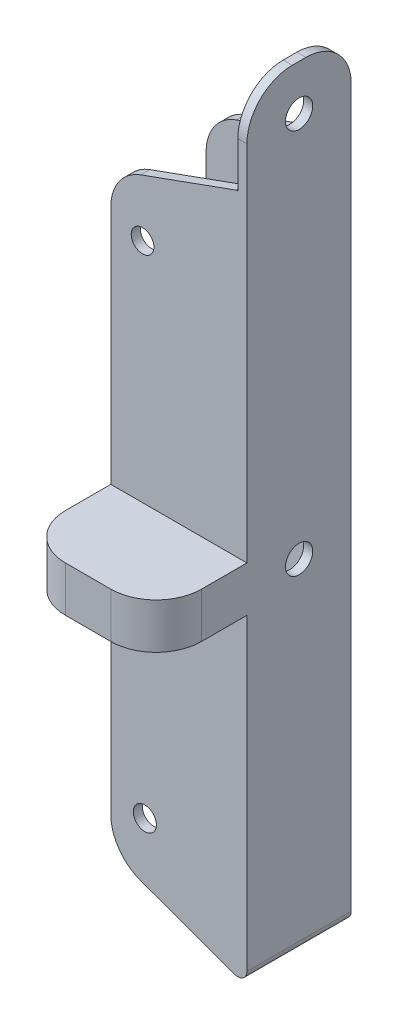
ISO-10303-21;
HEADER;
FILE_DESCRIPTION(('STEP AP214'),'2;1');
FILE_NAME('part.step','',(''),(''),'','','');
FILE_SCHEMA(('AUTOMOTIVE_DESIGN { 1 0 10303 214 1 1 1 1 }'));
ENDSEC;
DATA;
#1=APPLICATION_CONTEXT('core data for automotive mechanical design processes');
#2=APPLICATION_PROTOCOL_DEFINITION('international standard','automotive_design',2000,#1);
#3=PRODUCT_CONTEXT('',#1,'mechanical');
#4=PRODUCT('Part','Part','',(#3));
#5=PRODUCT_RELATED_PRODUCT_CATEGORY('part','',(#4));
#6=PRODUCT_DEFINITION_FORMATION('','',#4);
#7=PRODUCT_DEFINITION_CONTEXT('part definition',#1,'design');
#8=PRODUCT_DEFINITION('design','',#6,#7);
#9=PRODUCT_DEFINITION_SHAPE('','',#8);
#10=(LENGTH_UNIT() NAMED_UNIT(*) SI_UNIT(.MILLI.,.METRE.));
#11=(NAMED_UNIT(*) PLANE_ANGLE_UNIT() SI_UNIT($,.RADIAN.));
#12=(NAMED_UNIT(*) SI_UNIT($,.STERADIAN.) SOLID_ANGLE_UNIT());
#13=UNCERTAINTY_MEASURE_WITH_UNIT(LENGTH_MEASURE(1.E-05),#10,'distance_accuracy_value','');
#14=(GEOMETRIC_REPRESENTATION_CONTEXT(3) GLOBAL_UNCERTAINTY_ASSIGNED_CONTEXT((#13)) GLOBAL_UNIT_ASSIGNED_CONTEXT((#10,
#11,#12)) REPRESENTATION_CONTEXT('',''));
#15=CARTESIAN_POINT('',(0.,0.,0.));
#16=DIRECTION('',(0.,0.,1.));
#17=DIRECTION('',(1.,0.,0.));
#18=AXIS2_PLACEMENT_3D('',#15,#16,#17);
#19=CARTESIAN_POINT('',(0.,0.,23.));
#20=DIRECTION('',(0.,1.,0.));
#21=DIRECTION('',(0.,0.,1.));
#22=AXIS2_PLACEMENT_3D('',#19,#20,#21);
#23=PLANE('',#22);
#24=DIRECTION('',(1.,0.,0.));
#25=VECTOR('',#24,1.);
#26=CARTESIAN_POINT('',(0.,0.,0.));
#27=LINE('',#26,#25);
#28=CARTESIAN_POINT('',(27.6983675078145,0.,0.));
#29=VERTEX_POINT('',#28);
#30=CARTESIAN_POINT('',(28.,0.,0.));
#31=VERTEX_POINT('',#30);
#32=EDGE_CURVE('E257',#29,#31,#27,.T.);
#33=ORIENTED_EDGE('',*,*,#32,.T.);
#34=DIRECTION('',(0.,0.,-1.));
#35=VECTOR('',#34,1.);
#36=CARTESIAN_POINT('',(28.,0.,23.));
#37=LINE('',#36,#35);
#38=CARTESIAN_POINT('',(28.,0.,2.));
#39=VERTEX_POINT('',#38);
#40=EDGE_CURVE('E43',#31,#39,#37,.F.);
#41=ORIENTED_EDGE('',*,*,#40,.T.);
#42=DIRECTION('',(1.,0.,0.));
#43=VECTOR('',#42,1.);
#44=CARTESIAN_POINT('',(0.,0.,2.));
#45=LINE('',#44,#43);
#46=CARTESIAN_POINT('',(27.6983675078145,0.,2.));
#47=VERTEX_POINT('',#46);
#48=EDGE_CURVE('E258',#47,#39,#45,.T.);
#49=ORIENTED_EDGE('',*,*,#48,.F.);
#50=DIRECTION('',(0.,0.,1.));
#51=VECTOR('',#50,1.);
#52=CARTESIAN_POINT('',(27.6983675078145,0.,-7.));
#53=LINE('',#52,#51);
#54=EDGE_CURVE('E226',#29,#47,#53,.T.);
#55=ORIENTED_EDGE('',*,*,#54,.F.);
#56=EDGE_LOOP('',(#33,#41,#49,#55));
#57=FACE_BOUND('',#56,.T.);
#58=ADVANCED_FACE('F35',(#57),#23,.F.);
#59=CARTESIAN_POINT('',(0.,0.,23.));
#60=DIRECTION('',(0.,0.,-1.));
#61=DIRECTION('',(-1.,0.,0.));
#62=AXIS2_PLACEMENT_3D('',#59,#60,#61);
#63=PLANE('',#62);
#64=CARTESIAN_POINT('',(7.5,20.,23.));
#65=DIRECTION('',(0.,0.,1.));
#66=DIRECTION('',(1.,0.,0.));
#67=AXIS2_PLACEMENT_3D('',#64,#65,#66);
#68=CIRCLE('',#67,2.54323018402444);
#69=CARTESIAN_POINT('',(10.0432301840244,20.,23.));
#70=VERTEX_POINT('',#69);
#71=EDGE_CURVE('E318',#70,#70,#68,.T.);
#72=ORIENTED_EDGE('',*,*,#71,.F.);
#73=EDGE_LOOP('',(#72));
#74=FACE_BOUND('',#73,.T.);
#75=DIRECTION('',(1.,0.,0.));
#76=VECTOR('',#75,1.);
#77=CARTESIAN_POINT('',(0.,0.,23.));
#78=LINE('',#77,#76);
#79=CARTESIAN_POINT('',(27.6983675078145,0.,23.));
#80=VERTEX_POINT('',#79);
#81=CARTESIAN_POINT('',(28.,0.,23.));
#82=VERTEX_POINT('',#81);
#83=EDGE_CURVE('E395',#80,#82,#78,.T.);
#84=ORIENTED_EDGE('',*,*,#83,.T.);
#85=CARTESIAN_POINT('',(28.,2.,23.));
#86=DIRECTION('',(0.,0.,-1.));
#87=DIRECTION('',(-1.,0.,0.));
#88=AXIS2_PLACEMENT_3D('',#85,#86,#87);
#89=CIRCLE('',#88,2.);
#90=CARTESIAN_POINT('',(30.,2.,23.));
#91=VERTEX_POINT('',#90);
#92=EDGE_CURVE('E11',#82,#91,#89,.F.);
#93=ORIENTED_EDGE('',*,*,#92,.T.);
#94=DIRECTION('',(0.,1.,0.));
#95=VECTOR('',#94,1.);
#96=CARTESIAN_POINT('',(30.,0.,23.));
#97=LINE('',#96,#95);
#98=CARTESIAN_POINT('',(30.,70.,23.));
#99=VERTEX_POINT('',#98);
#100=EDGE_CURVE('E245',#91,#99,#97,.T.);
#101=ORIENTED_EDGE('',*,*,#100,.T.);
#102=DIRECTION('',(1.,0.,0.));
#103=VECTOR('',#102,1.);
#104=CARTESIAN_POINT('',(0.,70.,23.));
#105=LINE('',#104,#103);
#106=CARTESIAN_POINT('',(0.,70.,23.));
#107=VERTEX_POINT('',#106);
#108=EDGE_CURVE('E275',#107,#99,#105,.T.);
#109=ORIENTED_EDGE('',*,*,#108,.F.);
#110=DIRECTION('',(0.,-1.,0.));
#111=VECTOR('',#110,1.);
#112=CARTESIAN_POINT('',(0.,0.,23.));
#113=LINE('',#112,#111);
#114=CARTESIAN_POINT('',(0.,17.0214435124316,23.));
#115=VERTEX_POINT('',#114);
#116=EDGE_CURVE('E264',#107,#115,#113,.T.);
#117=ORIENTED_EDGE('',*,*,#116,.T.);
#118=CARTESIAN_POINT('',(10.,17.0214435124316,23.));
#119=DIRECTION('',(0.,0.,-1.));
#120=DIRECTION('',(-1.,0.,0.));
#121=AXIS2_PLACEMENT_3D('',#118,#119,#120);
#122=CIRCLE('',#121,10.);
#123=CARTESIAN_POINT('',(6.60421273783303,7.61566715584599,23.));
#124=VERTEX_POINT('',#123);
#125=EDGE_CURVE('E299',#115,#124,#122,.F.);
#126=ORIENTED_EDGE('',*,*,#125,.T.);
#127=DIRECTION('',(-0.940577635658559,0.339578726216697,0.));
#128=VECTOR('',#127,1.);
#129=CARTESIAN_POINT('',(3.19400155424846,8.84686288701045,23.));
#130=LINE('',#129,#128);
#131=EDGE_CURVE('E533',#80,#124,#130,.T.);
#132=ORIENTED_EDGE('',*,*,#131,.F.);
#133=EDGE_LOOP('',(#84,#93,#101,#109,#117,#126,#132));
#134=FACE_BOUND('',#133,.T.);
#135=ADVANCED_FACE('F488',(#74,#134),#63,.F.);
#136=CARTESIAN_POINT('',(0.,150.,23.));
#137=DIRECTION('',(0.,-1.,0.));
#138=DIRECTION('',(0.,0.,-1.));
#139=AXIS2_PLACEMENT_3D('',#136,#137,#138);
#140=PLANE('',#139);
#141=DIRECTION('',(-1.,0.,0.));
#142=VECTOR('',#141,1.);
#143=CARTESIAN_POINT('',(0.,150.,0.));
#144=LINE('',#143,#142);
#145=CARTESIAN_POINT('',(28.0053234200893,150.,0.));
#146=VERTEX_POINT('',#145);
#147=CARTESIAN_POINT('',(27.6983675078144,150.,0.));
#148=VERTEX_POINT('',#147);
#149=EDGE_CURVE('E262',#146,#148,#144,.T.);
#150=ORIENTED_EDGE('',*,*,#149,.T.);
#151=DIRECTION('',(0.,0.,1.));
#152=VECTOR('',#151,1.);
#153=CARTESIAN_POINT('',(27.6983675078144,150.,-7.));
#154=LINE('',#153,#152);
#155=CARTESIAN_POINT('',(27.6983675078144,150.,2.));
#156=VERTEX_POINT('',#155);
#157=EDGE_CURVE('E237',#148,#156,#154,.T.);
#158=ORIENTED_EDGE('',*,*,#157,.T.);
#159=DIRECTION('',(1.,0.,0.));
#160=VECTOR('',#159,1.);
#161=CARTESIAN_POINT('',(0.,150.,2.));
#162=LINE('',#161,#160);
#163=CARTESIAN_POINT('',(28.,150.,2.));
#164=VERTEX_POINT('',#163);
#165=EDGE_CURVE('E432',#156,#164,#162,.T.);
#166=ORIENTED_EDGE('',*,*,#165,.T.);
#167=DIRECTION('',(0.,0.,1.));
#168=VECTOR('',#167,1.);
#169=CARTESIAN_POINT('',(28.,150.,0.));
#170=LINE('',#169,#168);
#171=CARTESIAN_POINT('',(28.,150.,21.));
#172=VERTEX_POINT('',#171);
#173=EDGE_CURVE('E383',#164,#172,#170,.T.);
#174=ORIENTED_EDGE('',*,*,#173,.T.);
#175=DIRECTION('',(1.,0.,0.));
#176=VECTOR('',#175,1.);
#177=CARTESIAN_POINT('',(0.,150.,21.));
#178=LINE('',#177,#176);
#179=CARTESIAN_POINT('',(27.6983675078145,150.,21.));
#180=VERTEX_POINT('',#179);
#181=EDGE_CURVE('E236',#180,#172,#178,.T.);
#182=ORIENTED_EDGE('',*,*,#181,.F.);
#183=CARTESIAN_POINT('',(27.6983675078144,150.,23.));
#184=VERTEX_POINT('',#183);
#185=EDGE_CURVE('E220',#180,#184,#154,.T.);
#186=ORIENTED_EDGE('',*,*,#185,.T.);
#187=DIRECTION('',(-1.,0.,0.));
#188=VECTOR('',#187,1.);
#189=CARTESIAN_POINT('',(0.,150.,23.));
#190=LINE('',#189,#188);
#191=CARTESIAN_POINT('',(28.0053234200893,150.,23.));
#192=VERTEX_POINT('',#191);
#193=EDGE_CURVE('E233',#192,#184,#190,.T.);
#194=ORIENTED_EDGE('',*,*,#193,.F.);
#195=DIRECTION('',(0.,0.,1.));
#196=VECTOR('',#195,1.);
#197=CARTESIAN_POINT('',(28.0053234200893,150.,0.));
#198=LINE('',#197,#196);
#199=EDGE_CURVE('E272',#146,#192,#198,.T.);
#200=ORIENTED_EDGE('',*,*,#199,.F.);
#201=EDGE_LOOP('',(#150,#158,#166,#174,#182,#186,#194,#200));
#202=FACE_BOUND('',#201,.T.);
#203=ADVANCED_FACE('F231',(#202),#140,.F.);
#204=CARTESIAN_POINT('',(0.,0.,23.));
#205=DIRECTION('',(1.,0.,0.));
#206=DIRECTION('',(0.,0.,-1.));
#207=AXIS2_PLACEMENT_3D('',#204,#205,#206);
#208=PLANE('',#207);
#209=DIRECTION('',(0.,-1.,0.));
#210=VECTOR('',#209,1.);
#211=CARTESIAN_POINT('',(0.,0.,0.));
#212=LINE('',#211,#210);
#213=CARTESIAN_POINT('',(0.,132.978556487568,0.));
#214=VERTEX_POINT('',#213);
#215=CARTESIAN_POINT('',(0.,17.0214435124316,0.));
#216=VERTEX_POINT('',#215);
#217=EDGE_CURVE('E254',#214,#216,#212,.T.);
#218=ORIENTED_EDGE('',*,*,#217,.T.);
#219=DIRECTION('',(0.,0.,1.));
#220=VECTOR('',#219,1.);
#221=CARTESIAN_POINT('',(0.,17.0214435124316,23.));
#222=LINE('',#221,#220);
#223=CARTESIAN_POINT('',(0.,17.0214435124316,2.));
#224=VERTEX_POINT('',#223);
#225=EDGE_CURVE('E281',#216,#224,#222,.T.);
#226=ORIENTED_EDGE('',*,*,#225,.T.);
#227=DIRECTION('',(0.,1.,0.));
#228=VECTOR('',#227,1.);
#229=CARTESIAN_POINT('',(0.,-43.,2.));
#230=LINE('',#229,#228);
#231=CARTESIAN_POINT('',(0.,132.978556487568,2.));
#232=VERTEX_POINT('',#231);
#233=EDGE_CURVE('E384',#224,#232,#230,.T.);
#234=ORIENTED_EDGE('',*,*,#233,.T.);
#235=DIRECTION('',(0.,0.,1.));
#236=VECTOR('',#235,1.);
#237=CARTESIAN_POINT('',(0.,132.978556487568,23.));
#238=LINE('',#237,#236);
#239=EDGE_CURVE('E279',#232,#214,#238,.F.);
#240=ORIENTED_EDGE('',*,*,#239,.T.);
#241=EDGE_LOOP('',(#218,#226,#234,#240));
#242=FACE_BOUND('',#241,.T.);
#243=ADVANCED_FACE('F497',(#242),#208,.F.);
#244=DIRECTION('',(1.,0.,0.));
#245=VECTOR('',#244,1.);
#246=CARTESIAN_POINT('',(0.,0.,21.));
#247=LINE('',#246,#245);
#248=CARTESIAN_POINT('',(27.6983675078145,0.,21.));
#249=VERTEX_POINT('',#248);
#250=CARTESIAN_POINT('',(28.,0.,21.));
#251=VERTEX_POINT('',#250);
#252=EDGE_CURVE('E388',#249,#251,#247,.T.);
#253=ORIENTED_EDGE('',*,*,#252,.T.);
#254=DIRECTION('',(0.,0.,-1.));
#255=VECTOR('',#254,1.);
#256=CARTESIAN_POINT('',(28.,0.,23.));
#257=LINE('',#256,#255);
#258=EDGE_CURVE('E50',#251,#82,#257,.F.);
#259=ORIENTED_EDGE('',*,*,#258,.T.);
#260=ORIENTED_EDGE('',*,*,#83,.F.);
#261=EDGE_CURVE('E537',#249,#80,#53,.T.);
#262=ORIENTED_EDGE('',*,*,#261,.F.);
#263=EDGE_LOOP('',(#253,#259,#260,#262));
#264=FACE_BOUND('',#263,.T.);
#265=ADVANCED_FACE('F500',(#264),#23,.F.);
#266=DIRECTION('',(0.,0.,-1.));
#267=VECTOR('',#266,1.);
#268=CARTESIAN_POINT('',(0.,70.,43.));
#269=LINE('',#268,#267);
#270=CARTESIAN_POINT('',(0.,70.,33.));
#271=VERTEX_POINT('',#270);
#272=EDGE_CURVE('E469',#271,#107,#269,.T.);
#273=ORIENTED_EDGE('',*,*,#272,.F.);
#274=DIRECTION('',(0.,-1.,0.));
#275=VECTOR('',#274,1.);
#276=CARTESIAN_POINT('',(0.,80.,33.));
#277=LINE('',#276,#275);
#278=CARTESIAN_POINT('',(0.,80.,33.));
#279=VERTEX_POINT('',#278);
#280=EDGE_CURVE('E334',#271,#279,#277,.F.);
#281=ORIENTED_EDGE('',*,*,#280,.T.);
#282=DIRECTION('',(0.,0.,-1.));
#283=VECTOR('',#282,1.);
#284=CARTESIAN_POINT('',(0.,80.,43.));
#285=LINE('',#284,#283);
#286=CARTESIAN_POINT('',(0.,80.,23.));
#287=VERTEX_POINT('',#286);
#288=EDGE_CURVE('E452',#279,#287,#285,.T.);
#289=ORIENTED_EDGE('',*,*,#288,.T.);
#290=CARTESIAN_POINT('',(0.,132.978556487568,23.));
#291=VERTEX_POINT('',#290);
#292=EDGE_CURVE('E393',#291,#287,#113,.T.);
#293=ORIENTED_EDGE('',*,*,#292,.F.);
#294=DIRECTION('',(0.,0.,1.));
#295=VECTOR('',#294,1.);
#296=CARTESIAN_POINT('',(0.,132.978556487568,23.));
#297=LINE('',#296,#295);
#298=CARTESIAN_POINT('',(0.,132.978556487568,21.));
#299=VERTEX_POINT('',#298);
#300=EDGE_CURVE('E294',#291,#299,#297,.F.);
#301=ORIENTED_EDGE('',*,*,#300,.T.);
#302=DIRECTION('',(0.,1.,0.));
#303=VECTOR('',#302,1.);
#304=CARTESIAN_POINT('',(0.,-43.,21.));
#305=LINE('',#304,#303);
#306=CARTESIAN_POINT('',(0.,17.0214435124316,21.));
#307=VERTEX_POINT('',#306);
#308=EDGE_CURVE('E434',#307,#299,#305,.T.);
#309=ORIENTED_EDGE('',*,*,#308,.F.);
#310=DIRECTION('',(0.,0.,1.));
#311=VECTOR('',#310,1.);
#312=CARTESIAN_POINT('',(0.,17.0214435124316,23.));
#313=LINE('',#312,#311);
#314=EDGE_CURVE('E296',#307,#115,#313,.T.);
#315=ORIENTED_EDGE('',*,*,#314,.T.);
#316=ORIENTED_EDGE('',*,*,#116,.F.);
#317=EDGE_LOOP('',(#273,#281,#289,#293,#301,#309,#315,#316));
#318=FACE_BOUND('',#317,.T.);
#319=ADVANCED_FACE('F450',(#318),#208,.F.);
#320=CARTESIAN_POINT('',(30.,0.,23.));
#321=DIRECTION('',(-1.,0.,0.));
#322=DIRECTION('',(0.,0.,1.));
#323=AXIS2_PLACEMENT_3D('',#320,#321,#322);
#324=PLANE('',#323);
#325=CARTESIAN_POINT('',(30.,75.,11.5));
#326=DIRECTION('',(1.,0.,0.));
#327=DIRECTION('',(0.,0.,-1.));
#328=AXIS2_PLACEMENT_3D('',#325,#326,#327);
#329=CIRCLE('',#328,3.);
#330=CARTESIAN_POINT('',(30.,75.,8.5));
#331=VERTEX_POINT('',#330);
#332=EDGE_CURVE('E269',#331,#331,#329,.T.);
#333=ORIENTED_EDGE('',*,*,#332,.F.);
#334=EDGE_LOOP('',(#333));
#335=FACE_BOUND('',#334,.T.);
#336=CARTESIAN_POINT('',(30.,160.,11.5));
#337=DIRECTION('',(1.,0.,0.));
#338=DIRECTION('',(0.,0.,-1.));
#339=AXIS2_PLACEMENT_3D('',#336,#337,#338);
#340=CIRCLE('',#339,3.);
#341=CARTESIAN_POINT('',(30.,160.,8.5));
#342=VERTEX_POINT('',#341);
#343=EDGE_CURVE('E424',#342,#342,#340,.T.);
#344=ORIENTED_EDGE('',*,*,#343,.F.);
#345=EDGE_LOOP('',(#344));
#346=FACE_BOUND('',#345,.T.);
#347=ORIENTED_EDGE('',*,*,#100,.F.);
#348=DIRECTION('',(0.,0.,-1.));
#349=VECTOR('',#348,1.);
#350=CARTESIAN_POINT('',(30.,2.,23.));
#351=LINE('',#350,#349);
#352=CARTESIAN_POINT('',(30.,2.,0.));
#353=VERTEX_POINT('',#352);
#354=EDGE_CURVE('E354',#91,#353,#351,.T.);
#355=ORIENTED_EDGE('',*,*,#354,.T.);
#356=DIRECTION('',(0.,1.,0.));
#357=VECTOR('',#356,1.);
#358=CARTESIAN_POINT('',(30.,0.,0.));
#359=LINE('',#358,#357);
#360=CARTESIAN_POINT('',(30.,160.,0.));
#361=VERTEX_POINT('',#360);
#362=EDGE_CURVE('E260',#353,#361,#359,.T.);
#363=ORIENTED_EDGE('',*,*,#362,.T.);
#364=CARTESIAN_POINT('',(30.,160.,10.));
#365=DIRECTION('',(-1.,0.,0.));
#366=DIRECTION('',(0.,0.,1.));
#367=AXIS2_PLACEMENT_3D('',#364,#365,#366);
#368=CIRCLE('',#367,10.);
#369=CARTESIAN_POINT('',(30.,170.,10.));
#370=VERTEX_POINT('',#369);
#371=EDGE_CURVE('E350',#361,#370,#368,.F.);
#372=ORIENTED_EDGE('',*,*,#371,.T.);
#373=DIRECTION('',(0.,0.,1.));
#374=VECTOR('',#373,1.);
#375=CARTESIAN_POINT('',(30.,170.,0.));
#376=LINE('',#375,#374);
#377=CARTESIAN_POINT('',(30.,170.,13.));
#378=VERTEX_POINT('',#377);
#379=EDGE_CURVE('E419',#370,#378,#376,.T.);
#380=ORIENTED_EDGE('',*,*,#379,.T.);
#381=CARTESIAN_POINT('',(30.,160.,13.));
#382=DIRECTION('',(-1.,0.,0.));
#383=DIRECTION('',(0.,0.,1.));
#384=AXIS2_PLACEMENT_3D('',#381,#382,#383);
#385=CIRCLE('',#384,10.);
#386=CARTESIAN_POINT('',(30.,160.,23.));
#387=VERTEX_POINT('',#386);
#388=EDGE_CURVE('E348',#378,#387,#385,.F.);
#389=ORIENTED_EDGE('',*,*,#388,.T.);
#390=CARTESIAN_POINT('',(30.,80.,23.));
#391=VERTEX_POINT('',#390);
#392=EDGE_CURVE('E250',#391,#387,#97,.T.);
#393=ORIENTED_EDGE('',*,*,#392,.F.);
#394=DIRECTION('',(0.,0.,-1.));
#395=VECTOR('',#394,1.);
#396=CARTESIAN_POINT('',(30.,80.,43.));
#397=LINE('',#396,#395);
#398=CARTESIAN_POINT('',(30.,80.,33.));
#399=VERTEX_POINT('',#398);
#400=EDGE_CURVE('E456',#399,#391,#397,.T.);
#401=ORIENTED_EDGE('',*,*,#400,.F.);
#402=DIRECTION('',(0.,1.,0.));
#403=VECTOR('',#402,1.);
#404=CARTESIAN_POINT('',(30.,70.,33.));
#405=LINE('',#404,#403);
#406=CARTESIAN_POINT('',(30.,70.,33.));
#407=VERTEX_POINT('',#406);
#408=EDGE_CURVE('E328',#399,#407,#405,.F.);
#409=ORIENTED_EDGE('',*,*,#408,.T.);
#410=DIRECTION('',(0.,0.,-1.));
#411=VECTOR('',#410,1.);
#412=CARTESIAN_POINT('',(30.,70.,43.));
#413=LINE('',#412,#411);
#414=EDGE_CURVE('E459',#407,#99,#413,.T.);
#415=ORIENTED_EDGE('',*,*,#414,.T.);
#416=EDGE_LOOP('',(#347,#355,#363,#372,#380,#389,#393,#401,#409,#415));
#417=FACE_BOUND('',#416,.T.);
#418=ADVANCED_FACE('F479',(#335,#346,#417),#324,.F.);
#419=CARTESIAN_POINT('',(7.00133085502233,130.,23.));
#420=DIRECTION('',(0.,0.,1.));
#421=DIRECTION('',(1.,0.,0.));
#422=AXIS2_PLACEMENT_3D('',#419,#420,#421);
#423=CIRCLE('',#422,2.5);
#424=CARTESIAN_POINT('',(9.50133085502233,130.,23.));
#425=VERTEX_POINT('',#424);
#426=EDGE_CURVE('E276',#425,#425,#423,.T.);
#427=ORIENTED_EDGE('',*,*,#426,.F.);
#428=EDGE_LOOP('',(#427));
#429=FACE_BOUND('',#428,.T.);
#430=ORIENTED_EDGE('',*,*,#392,.T.);
#431=DIRECTION('',(-1.,0.,0.));
#432=VECTOR('',#431,1.);
#433=CARTESIAN_POINT('',(28.0053234200893,160.,23.));
#434=LINE('',#433,#432);
#435=CARTESIAN_POINT('',(28.0053234200893,160.,23.));
#436=VERTEX_POINT('',#435);
#437=EDGE_CURVE('E352',#387,#436,#434,.T.);
#438=ORIENTED_EDGE('',*,*,#437,.T.);
#439=DIRECTION('',(0.,-1.,0.));
#440=VECTOR('',#439,1.);
#441=CARTESIAN_POINT('',(28.0053234200893,170.,23.));
#442=LINE('',#441,#440);
#443=EDGE_CURVE('E243',#436,#192,#442,.T.);
#444=ORIENTED_EDGE('',*,*,#443,.T.);
#445=ORIENTED_EDGE('',*,*,#193,.T.);
#446=DIRECTION('',(0.940577635658559,0.339578726216698,0.));
#447=VECTOR('',#446,1.);
#448=CARTESIAN_POINT('',(-44.7160217594785,123.856080418146,23.));
#449=LINE('',#448,#447);
#450=CARTESIAN_POINT('',(6.60421273783302,142.384332844154,23.));
#451=VERTEX_POINT('',#450);
#452=EDGE_CURVE('E216',#451,#184,#449,.T.);
#453=ORIENTED_EDGE('',*,*,#452,.F.);
#454=CARTESIAN_POINT('',(10.,132.978556487568,23.));
#455=DIRECTION('',(0.,0.,-1.));
#456=DIRECTION('',(-1.,0.,0.));
#457=AXIS2_PLACEMENT_3D('',#454,#455,#456);
#458=CIRCLE('',#457,10.);
#459=EDGE_CURVE('E311',#451,#291,#458,.F.);
#460=ORIENTED_EDGE('',*,*,#459,.T.);
#461=ORIENTED_EDGE('',*,*,#292,.T.);
#462=DIRECTION('',(1.,0.,0.));
#463=VECTOR('',#462,1.);
#464=CARTESIAN_POINT('',(0.,80.,23.));
#465=LINE('',#464,#463);
#466=EDGE_CURVE('E402',#287,#391,#465,.T.);
#467=ORIENTED_EDGE('',*,*,#466,.T.);
#468=EDGE_LOOP('',(#430,#438,#444,#445,#453,#460,#461,#467));
#469=FACE_BOUND('',#468,.T.);
#470=ADVANCED_FACE('F240',(#429,#469),#63,.F.);
#471=CARTESIAN_POINT('',(0.,0.,0.));
#472=DIRECTION('',(0.,0.,-1.));
#473=DIRECTION('',(-1.,0.,0.));
#474=AXIS2_PLACEMENT_3D('',#471,#472,#473);
#475=PLANE('',#474);
#476=CARTESIAN_POINT('',(7.5,20.,0.));
#477=DIRECTION('',(0.,0.,-1.));
#478=DIRECTION('',(-1.,0.,0.));
#479=AXIS2_PLACEMENT_3D('',#476,#477,#478);
#480=CIRCLE('',#479,2.54323018402444);
#481=CARTESIAN_POINT('',(4.95676981597556,20.,0.));
#482=VERTEX_POINT('',#481);
#483=EDGE_CURVE('E538',#482,#482,#480,.T.);
#484=ORIENTED_EDGE('',*,*,#483,.F.);
#485=EDGE_LOOP('',(#484));
#486=FACE_BOUND('',#485,.T.);
#487=ORIENTED_EDGE('',*,*,#362,.F.);
#488=CARTESIAN_POINT('',(28.,2.,0.));
#489=DIRECTION('',(0.,0.,-1.));
#490=DIRECTION('',(-1.,0.,0.));
#491=AXIS2_PLACEMENT_3D('',#488,#489,#490);
#492=CIRCLE('',#491,2.);
#493=EDGE_CURVE('E58',#353,#31,#492,.T.);
#494=ORIENTED_EDGE('',*,*,#493,.T.);
#495=ORIENTED_EDGE('',*,*,#32,.F.);
#496=DIRECTION('',(0.940577635658559,-0.339578726216697,0.));
#497=VECTOR('',#496,1.);
#498=CARTESIAN_POINT('',(3.19400155424846,8.84686288701046,0.));
#499=LINE('',#498,#497);
#500=CARTESIAN_POINT('',(6.60421273783303,7.61566715584599,0.));
#501=VERTEX_POINT('',#500);
#502=EDGE_CURVE('E545',#501,#29,#499,.T.);
#503=ORIENTED_EDGE('',*,*,#502,.F.);
#504=CARTESIAN_POINT('',(10.,17.0214435124316,0.));
#505=DIRECTION('',(0.,0.,-1.));
#506=DIRECTION('',(-1.,0.,0.));
#507=AXIS2_PLACEMENT_3D('',#504,#505,#506);
#508=CIRCLE('',#507,10.);
#509=EDGE_CURVE('E292',#501,#216,#508,.T.);
#510=ORIENTED_EDGE('',*,*,#509,.T.);
#511=ORIENTED_EDGE('',*,*,#217,.F.);
#512=CARTESIAN_POINT('',(10.,132.978556487568,0.));
#513=DIRECTION('',(0.,0.,-1.));
#514=DIRECTION('',(-1.,0.,0.));
#515=AXIS2_PLACEMENT_3D('',#512,#513,#514);
#516=CIRCLE('',#515,10.);
#517=CARTESIAN_POINT('',(6.60421273783303,142.384332844154,0.));
#518=VERTEX_POINT('',#517);
#519=EDGE_CURVE('E290',#214,#518,#516,.T.);
#520=ORIENTED_EDGE('',*,*,#519,.T.);
#521=DIRECTION('',(-0.940577635658559,-0.339578726216698,0.));
#522=VECTOR('',#521,1.);
#523=CARTESIAN_POINT('',(-44.7160217594785,123.856080418146,0.));
#524=LINE('',#523,#522);
#525=EDGE_CURVE('E516',#148,#518,#524,.T.);
#526=ORIENTED_EDGE('',*,*,#525,.F.);
#527=ORIENTED_EDGE('',*,*,#149,.F.);
#528=DIRECTION('',(0.,-1.,0.));
#529=VECTOR('',#528,1.);
#530=CARTESIAN_POINT('',(28.0053234200893,170.,0.));
#531=LINE('',#530,#529);
#532=CARTESIAN_POINT('',(28.0053234200893,160.,0.));
#533=VERTEX_POINT('',#532);
#534=EDGE_CURVE('E427',#533,#146,#531,.T.);
#535=ORIENTED_EDGE('',*,*,#534,.F.);
#536=DIRECTION('',(-1.,0.,0.));
#537=VECTOR('',#536,1.);
#538=CARTESIAN_POINT('',(0.,160.,0.));
#539=LINE('',#538,#537);
#540=EDGE_CURVE('E345',#533,#361,#539,.F.);
#541=ORIENTED_EDGE('',*,*,#540,.T.);
#542=EDGE_LOOP('',(#487,#494,#495,#503,#510,#511,#520,#526,#527,#535,#541));
#543=FACE_BOUND('',#542,.T.);
#544=ADVANCED_FACE('F505',(#486,#543),#475,.T.);
#545=CARTESIAN_POINT('',(0.,-43.,2.));
#546=DIRECTION('',(0.,0.,1.));
#547=DIRECTION('',(1.,0.,0.));
#548=AXIS2_PLACEMENT_3D('',#545,#546,#547);
#549=PLANE('',#548);
#550=CARTESIAN_POINT('',(7.5,20.,2.));
#551=DIRECTION('',(0.,0.,1.));
#552=DIRECTION('',(1.,0.,0.));
#553=AXIS2_PLACEMENT_3D('',#550,#551,#552);
#554=CIRCLE('',#553,2.54323018402444);
#555=CARTESIAN_POINT('',(10.0432301840244,20.,2.));
#556=VERTEX_POINT('',#555);
#557=EDGE_CURVE('E317',#556,#556,#554,.T.);
#558=ORIENTED_EDGE('',*,*,#557,.F.);
#559=EDGE_LOOP('',(#558));
#560=FACE_BOUND('',#559,.T.);
#561=ORIENTED_EDGE('',*,*,#233,.F.);
#562=CARTESIAN_POINT('',(10.,17.0214435124316,2.));
#563=DIRECTION('',(0.,0.,1.));
#564=DIRECTION('',(1.,0.,0.));
#565=AXIS2_PLACEMENT_3D('',#562,#563,#564);
#566=CIRCLE('',#565,10.);
#567=CARTESIAN_POINT('',(6.60421273783303,7.615667155846,2.));
#568=VERTEX_POINT('',#567);
#569=EDGE_CURVE('E286',#224,#568,#566,.T.);
#570=ORIENTED_EDGE('',*,*,#569,.T.);
#571=DIRECTION('',(-0.940577635658559,0.339578726216697,0.));
#572=VECTOR('',#571,1.);
#573=CARTESIAN_POINT('',(16.9282082375169,3.88837330115541,2.));
#574=LINE('',#573,#572);
#575=EDGE_CURVE('E375',#47,#568,#574,.T.);
#576=ORIENTED_EDGE('',*,*,#575,.F.);
#577=ORIENTED_EDGE('',*,*,#48,.T.);
#578=DIRECTION('',(0.,1.,0.));
#579=VECTOR('',#578,1.);
#580=CARTESIAN_POINT('',(28.,-43.,2.));
#581=LINE('',#580,#579);
#582=EDGE_CURVE('E372',#39,#164,#581,.T.);
#583=ORIENTED_EDGE('',*,*,#582,.T.);
#584=ORIENTED_EDGE('',*,*,#165,.F.);
#585=DIRECTION('',(0.940577635658559,0.339578726216698,0.));
#586=VECTOR('',#585,1.);
#587=CARTESIAN_POINT('',(-58.4502284427469,118.897590832291,2.));
#588=LINE('',#587,#586);
#589=CARTESIAN_POINT('',(6.60421273783302,142.384332844154,2.));
#590=VERTEX_POINT('',#589);
#591=EDGE_CURVE('E519',#590,#156,#588,.T.);
#592=ORIENTED_EDGE('',*,*,#591,.F.);
#593=CARTESIAN_POINT('',(10.,132.978556487568,2.));
#594=DIRECTION('',(0.,0.,1.));
#595=DIRECTION('',(1.,0.,0.));
#596=AXIS2_PLACEMENT_3D('',#593,#594,#595);
#597=CIRCLE('',#596,10.);
#598=EDGE_CURVE('E284',#590,#232,#597,.T.);
#599=ORIENTED_EDGE('',*,*,#598,.T.);
#600=EDGE_LOOP('',(#561,#570,#576,#577,#583,#584,#592,#599));
#601=FACE_BOUND('',#600,.T.);
#602=ADVANCED_FACE('F370',(#560,#601),#549,.T.);
#603=CARTESIAN_POINT('',(28.,-43.,0.));
#604=DIRECTION('',(-1.,0.,0.));
#605=DIRECTION('',(0.,0.,1.));
#606=AXIS2_PLACEMENT_3D('',#603,#604,#605);
#607=PLANE('',#606);
#608=CARTESIAN_POINT('',(28.,75.,11.5));
#609=DIRECTION('',(-1.,0.,0.));
#610=DIRECTION('',(0.,0.,1.));
#611=AXIS2_PLACEMENT_3D('',#608,#609,#610);
#612=CIRCLE('',#611,3.);
#613=CARTESIAN_POINT('',(28.,75.,14.5));
#614=VERTEX_POINT('',#613);
#615=EDGE_CURVE('E268',#614,#614,#612,.T.);
#616=ORIENTED_EDGE('',*,*,#615,.F.);
#617=EDGE_LOOP('',(#616));
#618=FACE_BOUND('',#617,.T.);
#619=DIRECTION('',(0.,0.,1.));
#620=VECTOR('',#619,1.);
#621=CARTESIAN_POINT('',(28.,0.,23.));
#622=LINE('',#621,#620);
#623=EDGE_CURVE('E376',#39,#251,#622,.T.);
#624=ORIENTED_EDGE('',*,*,#623,.T.);
#625=DIRECTION('',(0.,1.,0.));
#626=VECTOR('',#625,1.);
#627=CARTESIAN_POINT('',(28.,-43.,21.));
#628=LINE('',#627,#626);
#629=EDGE_CURVE('E385',#251,#172,#628,.T.);
#630=ORIENTED_EDGE('',*,*,#629,.T.);
#631=ORIENTED_EDGE('',*,*,#173,.F.);
#632=ORIENTED_EDGE('',*,*,#582,.F.);
#633=EDGE_LOOP('',(#624,#630,#631,#632));
#634=FACE_BOUND('',#633,.T.);
#635=ADVANCED_FACE('F380',(#618,#634),#607,.T.);
#636=CARTESIAN_POINT('',(0.,-43.,21.));
#637=DIRECTION('',(0.,0.,1.));
#638=DIRECTION('',(1.,0.,0.));
#639=AXIS2_PLACEMENT_3D('',#636,#637,#638);
#640=PLANE('',#639);
#641=CARTESIAN_POINT('',(7.5,20.,21.));
#642=DIRECTION('',(0.,0.,1.));
#643=DIRECTION('',(1.,0.,0.));
#644=AXIS2_PLACEMENT_3D('',#641,#642,#643);
#645=CIRCLE('',#644,2.54323018402444);
#646=CARTESIAN_POINT('',(10.0432301840244,20.,21.));
#647=VERTEX_POINT('',#646);
#648=EDGE_CURVE('E314',#647,#647,#645,.T.);
#649=ORIENTED_EDGE('',*,*,#648,.T.);
#650=EDGE_LOOP('',(#649));
#651=FACE_BOUND('',#650,.T.);
#652=CARTESIAN_POINT('',(7.00133085502233,130.,21.));
#653=DIRECTION('',(0.,0.,1.));
#654=DIRECTION('',(1.,0.,0.));
#655=AXIS2_PLACEMENT_3D('',#652,#653,#654);
#656=CIRCLE('',#655,2.5);
#657=CARTESIAN_POINT('',(9.50133085502233,130.,21.));
#658=VERTEX_POINT('',#657);
#659=EDGE_CURVE('E273',#658,#658,#656,.T.);
#660=ORIENTED_EDGE('',*,*,#659,.T.);
#661=EDGE_LOOP('',(#660));
#662=FACE_BOUND('',#661,.T.);
#663=DIRECTION('',(-0.940577635658559,0.339578726216697,0.));
#664=VECTOR('',#663,1.);
#665=CARTESIAN_POINT('',(16.9282082375169,3.88837330115541,21.));
#666=LINE('',#665,#664);
#667=CARTESIAN_POINT('',(6.60421273783303,7.615667155846,21.));
#668=VERTEX_POINT('',#667);
#669=EDGE_CURVE('E244',#249,#668,#666,.T.);
#670=ORIENTED_EDGE('',*,*,#669,.T.);
#671=CARTESIAN_POINT('',(10.,17.0214435124316,21.));
#672=DIRECTION('',(0.,0.,1.));
#673=DIRECTION('',(1.,0.,0.));
#674=AXIS2_PLACEMENT_3D('',#671,#672,#673);
#675=CIRCLE('',#674,10.);
#676=EDGE_CURVE('E305',#668,#307,#675,.F.);
#677=ORIENTED_EDGE('',*,*,#676,.T.);
#678=ORIENTED_EDGE('',*,*,#308,.T.);
#679=CARTESIAN_POINT('',(10.,132.978556487568,21.));
#680=DIRECTION('',(0.,0.,1.));
#681=DIRECTION('',(1.,0.,0.));
#682=AXIS2_PLACEMENT_3D('',#679,#680,#681);
#683=CIRCLE('',#682,10.);
#684=CARTESIAN_POINT('',(6.60421273783302,142.384332844154,21.));
#685=VERTEX_POINT('',#684);
#686=EDGE_CURVE('E303',#299,#685,#683,.F.);
#687=ORIENTED_EDGE('',*,*,#686,.T.);
#688=DIRECTION('',(0.940577635658559,0.339578726216698,0.));
#689=VECTOR('',#688,1.);
#690=CARTESIAN_POINT('',(-58.4502284427469,118.897590832291,21.));
#691=LINE('',#690,#689);
#692=EDGE_CURVE('E248',#685,#180,#691,.T.);
#693=ORIENTED_EDGE('',*,*,#692,.T.);
#694=ORIENTED_EDGE('',*,*,#181,.T.);
#695=ORIENTED_EDGE('',*,*,#629,.F.);
#696=ORIENTED_EDGE('',*,*,#252,.F.);
#697=EDGE_LOOP('',(#670,#677,#678,#687,#693,#694,#695,#696));
#698=FACE_BOUND('',#697,.T.);
#699=ADVANCED_FACE('F441',(#651,#662,#698),#640,.F.);
#700=CARTESIAN_POINT('',(28.0053234200893,170.,0.));
#701=DIRECTION('',(1.,0.,0.));
#702=DIRECTION('',(0.,0.,-1.));
#703=AXIS2_PLACEMENT_3D('',#700,#701,#702);
#704=PLANE('',#703);
#705=CARTESIAN_POINT('',(28.0053234200893,160.,11.5));
#706=DIRECTION('',(1.,0.,0.));
#707=DIRECTION('',(0.,0.,-1.));
#708=AXIS2_PLACEMENT_3D('',#705,#706,#707);
#709=CIRCLE('',#708,3.);
#710=CARTESIAN_POINT('',(28.0053234200893,160.,8.5));
#711=VERTEX_POINT('',#710);
#712=EDGE_CURVE('E265',#711,#711,#709,.T.);
#713=ORIENTED_EDGE('',*,*,#712,.T.);
#714=EDGE_LOOP('',(#713));
#715=FACE_BOUND('',#714,.T.);
#716=DIRECTION('',(0.,0.,1.));
#717=VECTOR('',#716,1.);
#718=CARTESIAN_POINT('',(28.0053234200893,170.,0.));
#719=LINE('',#718,#717);
#720=CARTESIAN_POINT('',(28.0053234200893,170.,10.));
#721=VERTEX_POINT('',#720);
#722=CARTESIAN_POINT('',(28.0053234200893,170.,13.));
#723=VERTEX_POINT('',#722);
#724=EDGE_CURVE('E413',#721,#723,#719,.T.);
#725=ORIENTED_EDGE('',*,*,#724,.F.);
#726=CARTESIAN_POINT('',(28.0053234200893,160.,10.));
#727=DIRECTION('',(1.,0.,0.));
#728=DIRECTION('',(0.,0.,-1.));
#729=AXIS2_PLACEMENT_3D('',#726,#727,#728);
#730=CIRCLE('',#729,10.);
#731=EDGE_CURVE('E343',#721,#533,#730,.F.);
#732=ORIENTED_EDGE('',*,*,#731,.T.);
#733=ORIENTED_EDGE('',*,*,#534,.T.);
#734=ORIENTED_EDGE('',*,*,#199,.T.);
#735=ORIENTED_EDGE('',*,*,#443,.F.);
#736=CARTESIAN_POINT('',(28.0053234200893,160.,13.));
#737=DIRECTION('',(1.,0.,0.));
#738=DIRECTION('',(0.,0.,-1.));
#739=AXIS2_PLACEMENT_3D('',#736,#737,#738);
#740=CIRCLE('',#739,10.);
#741=EDGE_CURVE('E341',#436,#723,#740,.F.);
#742=ORIENTED_EDGE('',*,*,#741,.T.);
#743=EDGE_LOOP('',(#725,#732,#733,#734,#735,#742));
#744=FACE_BOUND('',#743,.T.);
#745=ADVANCED_FACE('F412',(#715,#744),#704,.F.);
#746=CARTESIAN_POINT('',(0.,170.,0.));
#747=DIRECTION('',(0.,1.,0.));
#748=DIRECTION('',(0.,0.,1.));
#749=AXIS2_PLACEMENT_3D('',#746,#747,#748);
#750=PLANE('',#749);
#751=ORIENTED_EDGE('',*,*,#379,.F.);
#752=DIRECTION('',(-1.,0.,0.));
#753=VECTOR('',#752,1.);
#754=CARTESIAN_POINT('',(0.,170.,10.));
#755=LINE('',#754,#753);
#756=EDGE_CURVE('E338',#370,#721,#755,.T.);
#757=ORIENTED_EDGE('',*,*,#756,.T.);
#758=ORIENTED_EDGE('',*,*,#724,.T.);
#759=DIRECTION('',(-1.,0.,0.));
#760=VECTOR('',#759,1.);
#761=CARTESIAN_POINT('',(30.,170.,13.));
#762=LINE('',#761,#760);
#763=EDGE_CURVE('E336',#723,#378,#762,.F.);
#764=ORIENTED_EDGE('',*,*,#763,.T.);
#765=EDGE_LOOP('',(#751,#757,#758,#764));
#766=FACE_BOUND('',#765,.T.);
#767=ADVANCED_FACE('F416',(#766),#750,.T.);
#768=CARTESIAN_POINT('',(10.,160.,11.5));
#769=DIRECTION('',(1.,0.,0.));
#770=DIRECTION('',(0.,0.,-1.));
#771=AXIS2_PLACEMENT_3D('',#768,#769,#770);
#772=CYLINDRICAL_SURFACE('',#771,3.);
#773=ORIENTED_EDGE('',*,*,#343,.T.);
#774=EDGE_LOOP('',(#773));
#775=FACE_BOUND('',#774,.T.);
#776=ORIENTED_EDGE('',*,*,#712,.F.);
#777=EDGE_LOOP('',(#776));
#778=FACE_BOUND('',#777,.T.);
#779=ADVANCED_FACE('F476',(#775,#778),#772,.F.);
#780=CARTESIAN_POINT('',(10.,75.,11.5));
#781=DIRECTION('',(1.,0.,0.));
#782=DIRECTION('',(0.,0.,-1.));
#783=AXIS2_PLACEMENT_3D('',#780,#781,#782);
#784=CYLINDRICAL_SURFACE('',#783,3.);
#785=ORIENTED_EDGE('',*,*,#615,.T.);
#786=EDGE_LOOP('',(#785));
#787=FACE_BOUND('',#786,.T.);
#788=ORIENTED_EDGE('',*,*,#332,.T.);
#789=EDGE_LOOP('',(#788));
#790=FACE_BOUND('',#789,.T.);
#791=ADVANCED_FACE('F596',(#787,#790),#784,.F.);
#792=CARTESIAN_POINT('',(0.,70.,43.));
#793=DIRECTION('',(0.,1.,0.));
#794=DIRECTION('',(0.,0.,1.));
#795=AXIS2_PLACEMENT_3D('',#792,#793,#794);
#796=PLANE('',#795);
#797=ORIENTED_EDGE('',*,*,#414,.F.);
#798=CARTESIAN_POINT('',(20.,70.,33.));
#799=DIRECTION('',(0.,1.,0.));
#800=DIRECTION('',(0.,0.,1.));
#801=AXIS2_PLACEMENT_3D('',#798,#799,#800);
#802=CIRCLE('',#801,10.);
#803=CARTESIAN_POINT('',(20.,70.,43.));
#804=VERTEX_POINT('',#803);
#805=EDGE_CURVE('E332',#407,#804,#802,.F.);
#806=ORIENTED_EDGE('',*,*,#805,.T.);
#807=DIRECTION('',(1.,0.,0.));
#808=VECTOR('',#807,1.);
#809=CARTESIAN_POINT('',(0.,70.,43.));
#810=LINE('',#809,#808);
#811=CARTESIAN_POINT('',(10.,70.,43.));
#812=VERTEX_POINT('',#811);
#813=EDGE_CURVE('E462',#812,#804,#810,.T.);
#814=ORIENTED_EDGE('',*,*,#813,.F.);
#815=CARTESIAN_POINT('',(10.,70.,33.));
#816=DIRECTION('',(0.,1.,0.));
#817=DIRECTION('',(0.,0.,1.));
#818=AXIS2_PLACEMENT_3D('',#815,#816,#817);
#819=CIRCLE('',#818,10.);
#820=EDGE_CURVE('E330',#812,#271,#819,.F.);
#821=ORIENTED_EDGE('',*,*,#820,.T.);
#822=ORIENTED_EDGE('',*,*,#272,.T.);
#823=ORIENTED_EDGE('',*,*,#108,.T.);
#824=EDGE_LOOP('',(#797,#806,#814,#821,#822,#823));
#825=FACE_BOUND('',#824,.T.);
#826=ADVANCED_FACE('F525',(#825),#796,.F.);
#827=CARTESIAN_POINT('',(0.,80.,43.));
#828=DIRECTION('',(0.,1.,0.));
#829=DIRECTION('',(0.,0.,1.));
#830=AXIS2_PLACEMENT_3D('',#827,#828,#829);
#831=PLANE('',#830);
#832=DIRECTION('',(1.,0.,0.));
#833=VECTOR('',#832,1.);
#834=CARTESIAN_POINT('',(0.,80.,43.));
#835=LINE('',#834,#833);
#836=CARTESIAN_POINT('',(10.,80.,43.));
#837=VERTEX_POINT('',#836);
#838=CARTESIAN_POINT('',(20.,80.,43.));
#839=VERTEX_POINT('',#838);
#840=EDGE_CURVE('E457',#837,#839,#835,.T.);
#841=ORIENTED_EDGE('',*,*,#840,.T.);
#842=CARTESIAN_POINT('',(20.,80.,33.));
#843=DIRECTION('',(0.,1.,0.));
#844=DIRECTION('',(0.,0.,1.));
#845=AXIS2_PLACEMENT_3D('',#842,#843,#844);
#846=CIRCLE('',#845,10.);
#847=EDGE_CURVE('E326',#839,#399,#846,.T.);
#848=ORIENTED_EDGE('',*,*,#847,.T.);
#849=ORIENTED_EDGE('',*,*,#400,.T.);
#850=ORIENTED_EDGE('',*,*,#466,.F.);
#851=ORIENTED_EDGE('',*,*,#288,.F.);
#852=CARTESIAN_POINT('',(10.,80.,33.));
#853=DIRECTION('',(0.,1.,0.));
#854=DIRECTION('',(0.,0.,1.));
#855=AXIS2_PLACEMENT_3D('',#852,#853,#854);
#856=CIRCLE('',#855,10.);
#857=EDGE_CURVE('E324',#279,#837,#856,.T.);
#858=ORIENTED_EDGE('',*,*,#857,.T.);
#859=EDGE_LOOP('',(#841,#848,#849,#850,#851,#858));
#860=FACE_BOUND('',#859,.T.);
#861=ADVANCED_FACE('F587',(#860),#831,.T.);
#862=CARTESIAN_POINT('',(0.,0.,43.));
#863=DIRECTION('',(0.,0.,1.));
#864=DIRECTION('',(1.,0.,0.));
#865=AXIS2_PLACEMENT_3D('',#862,#863,#864);
#866=PLANE('',#865);
#867=ORIENTED_EDGE('',*,*,#813,.T.);
#868=DIRECTION('',(0.,1.,0.));
#869=VECTOR('',#868,1.);
#870=CARTESIAN_POINT('',(20.,80.,43.));
#871=LINE('',#870,#869);
#872=EDGE_CURVE('E321',#804,#839,#871,.T.);
#873=ORIENTED_EDGE('',*,*,#872,.T.);
#874=ORIENTED_EDGE('',*,*,#840,.F.);
#875=DIRECTION('',(0.,-1.,0.));
#876=VECTOR('',#875,1.);
#877=CARTESIAN_POINT('',(10.,70.,43.));
#878=LINE('',#877,#876);
#879=EDGE_CURVE('E313',#837,#812,#878,.T.);
#880=ORIENTED_EDGE('',*,*,#879,.T.);
#881=EDGE_LOOP('',(#867,#873,#874,#880));
#882=FACE_BOUND('',#881,.T.);
#883=ADVANCED_FACE('F582',(#882),#866,.T.);
#884=CARTESIAN_POINT('',(7.00133085502233,130.,13.));
#885=DIRECTION('',(0.,0.,1.));
#886=DIRECTION('',(1.,0.,0.));
#887=AXIS2_PLACEMENT_3D('',#884,#885,#886);
#888=CYLINDRICAL_SURFACE('',#887,2.5);
#889=ORIENTED_EDGE('',*,*,#426,.T.);
#890=EDGE_LOOP('',(#889));
#891=FACE_BOUND('',#890,.T.);
#892=ORIENTED_EDGE('',*,*,#659,.F.);
#893=EDGE_LOOP('',(#892));
#894=FACE_BOUND('',#893,.T.);
#895=ADVANCED_FACE('F578',(#891,#894),#888,.F.);
#896=CARTESIAN_POINT('',(3.19400155424846,8.84686288701045,-7.));
#897=DIRECTION('',(0.339578726216697,0.940577635658559,0.));
#898=DIRECTION('',(-0.940577635658559,0.339578726216697,0.));
#899=AXIS2_PLACEMENT_3D('',#896,#897,#898);
#900=PLANE('',#899);
#901=ORIENTED_EDGE('',*,*,#131,.T.);
#902=DIRECTION('',(0.,0.,1.));
#903=VECTOR('',#902,1.);
#904=CARTESIAN_POINT('',(6.60421273783303,7.61566715584599,-7.));
#905=LINE('',#904,#903);
#906=EDGE_CURVE('E301',#124,#668,#905,.F.);
#907=ORIENTED_EDGE('',*,*,#906,.T.);
#908=ORIENTED_EDGE('',*,*,#669,.F.);
#909=ORIENTED_EDGE('',*,*,#261,.T.);
#910=EDGE_LOOP('',(#901,#907,#908,#909));
#911=FACE_BOUND('',#910,.T.);
#912=ADVANCED_FACE('F535',(#911),#900,.F.);
#913=CARTESIAN_POINT('',(-44.7160217594785,123.856080418146,-7.));
#914=DIRECTION('',(0.339578726216698,-0.940577635658559,0.));
#915=DIRECTION('',(0.940577635658559,0.339578726216698,0.));
#916=AXIS2_PLACEMENT_3D('',#913,#914,#915);
#917=PLANE('',#916);
#918=ORIENTED_EDGE('',*,*,#692,.F.);
#919=DIRECTION('',(0.,0.,1.));
#920=VECTOR('',#919,1.);
#921=CARTESIAN_POINT('',(6.60421273783301,142.384332844154,-7.));
#922=LINE('',#921,#920);
#923=EDGE_CURVE('E223',#685,#451,#922,.T.);
#924=ORIENTED_EDGE('',*,*,#923,.T.);
#925=ORIENTED_EDGE('',*,*,#452,.T.);
#926=ORIENTED_EDGE('',*,*,#185,.F.);
#927=EDGE_LOOP('',(#918,#924,#925,#926));
#928=FACE_BOUND('',#927,.T.);
#929=ADVANCED_FACE('F219',(#928),#917,.F.);
#930=ORIENTED_EDGE('',*,*,#575,.T.);
#931=DIRECTION('',(0.,0.,1.));
#932=VECTOR('',#931,1.);
#933=CARTESIAN_POINT('',(6.60421273783303,7.61566715584599,-7.));
#934=LINE('',#933,#932);
#935=EDGE_CURVE('E288',#568,#501,#934,.F.);
#936=ORIENTED_EDGE('',*,*,#935,.T.);
#937=ORIENTED_EDGE('',*,*,#502,.T.);
#938=ORIENTED_EDGE('',*,*,#54,.T.);
#939=EDGE_LOOP('',(#930,#936,#937,#938));
#940=FACE_BOUND('',#939,.T.);
#941=ADVANCED_FACE('F567',(#940),#900,.F.);
#942=ORIENTED_EDGE('',*,*,#525,.T.);
#943=DIRECTION('',(0.,0.,1.));
#944=VECTOR('',#943,1.);
#945=CARTESIAN_POINT('',(6.60421273783301,142.384332844154,-7.));
#946=LINE('',#945,#944);
#947=EDGE_CURVE('E307',#518,#590,#946,.T.);
#948=ORIENTED_EDGE('',*,*,#947,.T.);
#949=ORIENTED_EDGE('',*,*,#591,.T.);
#950=ORIENTED_EDGE('',*,*,#157,.F.);
#951=EDGE_LOOP('',(#942,#948,#949,#950));
#952=FACE_BOUND('',#951,.T.);
#953=ADVANCED_FACE('F549',(#952),#917,.F.);
#954=CARTESIAN_POINT('',(10.,17.0214435124316,23.));
#955=DIRECTION('',(0.,0.,1.));
#956=DIRECTION('',(1.,0.,0.));
#957=AXIS2_PLACEMENT_3D('',#954,#955,#956);
#958=CYLINDRICAL_SURFACE('',#957,10.);
#959=ORIENTED_EDGE('',*,*,#509,.F.);
#960=ORIENTED_EDGE('',*,*,#935,.F.);
#961=ORIENTED_EDGE('',*,*,#569,.F.);
#962=ORIENTED_EDGE('',*,*,#225,.F.);
#963=EDGE_LOOP('',(#959,#960,#961,#962));
#964=FACE_BOUND('',#963,.T.);
#965=ADVANCED_FACE('F564',(#964),#958,.T.);
#966=CARTESIAN_POINT('',(10.,17.0214435124316,23.));
#967=DIRECTION('',(0.,0.,1.));
#968=DIRECTION('',(1.,0.,0.));
#969=AXIS2_PLACEMENT_3D('',#966,#967,#968);
#970=CYLINDRICAL_SURFACE('',#969,10.);
#971=ORIENTED_EDGE('',*,*,#676,.F.);
#972=ORIENTED_EDGE('',*,*,#906,.F.);
#973=ORIENTED_EDGE('',*,*,#125,.F.);
#974=ORIENTED_EDGE('',*,*,#314,.F.);
#975=EDGE_LOOP('',(#971,#972,#973,#974));
#976=FACE_BOUND('',#975,.T.);
#977=ADVANCED_FACE('F530',(#976),#970,.T.);
#978=CARTESIAN_POINT('',(10.,132.978556487568,-7.));
#979=DIRECTION('',(0.,0.,1.));
#980=DIRECTION('',(1.,0.,0.));
#981=AXIS2_PLACEMENT_3D('',#978,#979,#980);
#982=CYLINDRICAL_SURFACE('',#981,10.);
#983=ORIENTED_EDGE('',*,*,#519,.F.);
#984=ORIENTED_EDGE('',*,*,#239,.F.);
#985=ORIENTED_EDGE('',*,*,#598,.F.);
#986=ORIENTED_EDGE('',*,*,#947,.F.);
#987=EDGE_LOOP('',(#983,#984,#985,#986));
#988=FACE_BOUND('',#987,.T.);
#989=ADVANCED_FACE('F558',(#988),#982,.T.);
#990=CARTESIAN_POINT('',(10.,132.978556487568,-7.));
#991=DIRECTION('',(0.,0.,1.));
#992=DIRECTION('',(1.,0.,0.));
#993=AXIS2_PLACEMENT_3D('',#990,#991,#992);
#994=CYLINDRICAL_SURFACE('',#993,10.);
#995=ORIENTED_EDGE('',*,*,#686,.F.);
#996=ORIENTED_EDGE('',*,*,#300,.F.);
#997=ORIENTED_EDGE('',*,*,#459,.F.);
#998=ORIENTED_EDGE('',*,*,#923,.F.);
#999=EDGE_LOOP('',(#995,#996,#997,#998));
#1000=FACE_BOUND('',#999,.T.);
#1001=ADVANCED_FACE('F447',(#1000),#994,.T.);
#1002=CARTESIAN_POINT('',(7.5,20.,-7.));
#1003=DIRECTION('',(0.,0.,1.));
#1004=DIRECTION('',(1.,0.,0.));
#1005=AXIS2_PLACEMENT_3D('',#1002,#1003,#1004);
#1006=CYLINDRICAL_SURFACE('',#1005,2.54323018402444);
#1007=ORIENTED_EDGE('',*,*,#71,.T.);
#1008=EDGE_LOOP('',(#1007));
#1009=FACE_BOUND('',#1008,.T.);
#1010=ORIENTED_EDGE('',*,*,#648,.F.);
#1011=EDGE_LOOP('',(#1010));
#1012=FACE_BOUND('',#1011,.T.);
#1013=ADVANCED_FACE('F620',(#1009,#1012),#1006,.F.);
#1014=ORIENTED_EDGE('',*,*,#483,.T.);
#1015=EDGE_LOOP('',(#1014));
#1016=FACE_BOUND('',#1015,.T.);
#1017=ORIENTED_EDGE('',*,*,#557,.T.);
#1018=EDGE_LOOP('',(#1017));
#1019=FACE_BOUND('',#1018,.T.);
#1020=ADVANCED_FACE('F622',(#1016,#1019),#1006,.F.);
#1021=CARTESIAN_POINT('',(20.,0.,33.));
#1022=DIRECTION('',(0.,-1.,0.));
#1023=DIRECTION('',(0.,0.,-1.));
#1024=AXIS2_PLACEMENT_3D('',#1021,#1022,#1023);
#1025=CYLINDRICAL_SURFACE('',#1024,10.);
#1026=ORIENTED_EDGE('',*,*,#805,.F.);
#1027=ORIENTED_EDGE('',*,*,#408,.F.);
#1028=ORIENTED_EDGE('',*,*,#847,.F.);
#1029=ORIENTED_EDGE('',*,*,#872,.F.);
#1030=EDGE_LOOP('',(#1026,#1027,#1028,#1029));
#1031=FACE_BOUND('',#1030,.T.);
#1032=ADVANCED_FACE('F629',(#1031),#1025,.T.);
#1033=CARTESIAN_POINT('',(10.,0.,33.));
#1034=DIRECTION('',(0.,1.,0.));
#1035=DIRECTION('',(0.,0.,1.));
#1036=AXIS2_PLACEMENT_3D('',#1033,#1034,#1035);
#1037=CYLINDRICAL_SURFACE('',#1036,10.);
#1038=ORIENTED_EDGE('',*,*,#857,.F.);
#1039=ORIENTED_EDGE('',*,*,#280,.F.);
#1040=ORIENTED_EDGE('',*,*,#820,.F.);
#1041=ORIENTED_EDGE('',*,*,#879,.F.);
#1042=EDGE_LOOP('',(#1038,#1039,#1040,#1041));
#1043=FACE_BOUND('',#1042,.T.);
#1044=ADVANCED_FACE('F646',(#1043),#1037,.T.);
#1045=CARTESIAN_POINT('',(0.,160.,10.));
#1046=DIRECTION('',(-1.,0.,0.));
#1047=DIRECTION('',(0.,0.,1.));
#1048=AXIS2_PLACEMENT_3D('',#1045,#1046,#1047);
#1049=CYLINDRICAL_SURFACE('',#1048,10.);
#1050=ORIENTED_EDGE('',*,*,#371,.F.);
#1051=ORIENTED_EDGE('',*,*,#540,.F.);
#1052=ORIENTED_EDGE('',*,*,#731,.F.);
#1053=ORIENTED_EDGE('',*,*,#756,.F.);
#1054=EDGE_LOOP('',(#1050,#1051,#1052,#1053));
#1055=FACE_BOUND('',#1054,.T.);
#1056=ADVANCED_FACE('F650',(#1055),#1049,.T.);
#1057=CARTESIAN_POINT('',(0.,160.,13.));
#1058=DIRECTION('',(1.,0.,0.));
#1059=DIRECTION('',(0.,0.,-1.));
#1060=AXIS2_PLACEMENT_3D('',#1057,#1058,#1059);
#1061=CYLINDRICAL_SURFACE('',#1060,10.);
#1062=ORIENTED_EDGE('',*,*,#388,.F.);
#1063=ORIENTED_EDGE('',*,*,#763,.F.);
#1064=ORIENTED_EDGE('',*,*,#741,.F.);
#1065=ORIENTED_EDGE('',*,*,#437,.F.);
#1066=EDGE_LOOP('',(#1062,#1063,#1064,#1065));
#1067=FACE_BOUND('',#1066,.T.);
#1068=ADVANCED_FACE('F407',(#1067),#1061,.T.);
#1069=CARTESIAN_POINT('',(28.,2.,23.));
#1070=DIRECTION('',(0.,0.,-1.));
#1071=DIRECTION('',(-1.,0.,0.));
#1072=AXIS2_PLACEMENT_3D('',#1069,#1070,#1071);
#1073=CYLINDRICAL_SURFACE('',#1072,2.);
#1074=ORIENTED_EDGE('',*,*,#623,.F.);
#1075=ORIENTED_EDGE('',*,*,#40,.F.);
#1076=ORIENTED_EDGE('',*,*,#493,.F.);
#1077=ORIENTED_EDGE('',*,*,#354,.F.);
#1078=ORIENTED_EDGE('',*,*,#92,.F.);
#1079=ORIENTED_EDGE('',*,*,#258,.F.);
#1080=EDGE_LOOP('',(#1074,#1075,#1076,#1077,#1078,#1079));
#1081=FACE_BOUND('',#1080,.T.);
#1082=ADVANCED_FACE('F37',(#1081),#1073,.T.);
#1083=CLOSED_SHELL('',(#58,#135,#203,#243,#265,#319,#418,#470,#544,#602,#635,#699,#745,#767,
#779,#791,#826,#861,#883,#895,#912,#929,#941,#953,#965,#977,#989,#1001,#1013,#1020,#1032,#1044,
#1056,#1068,#1082));
#1084=MANIFOLD_SOLID_BREP('B2',#1083);
#1085=ADVANCED_BREP_SHAPE_REPRESENTATION('',(#18,#1084),#14);
#1086=SHAPE_DEFINITION_REPRESENTATION(#9,#1085);
ENDSEC;
END-ISO-10303-21;
